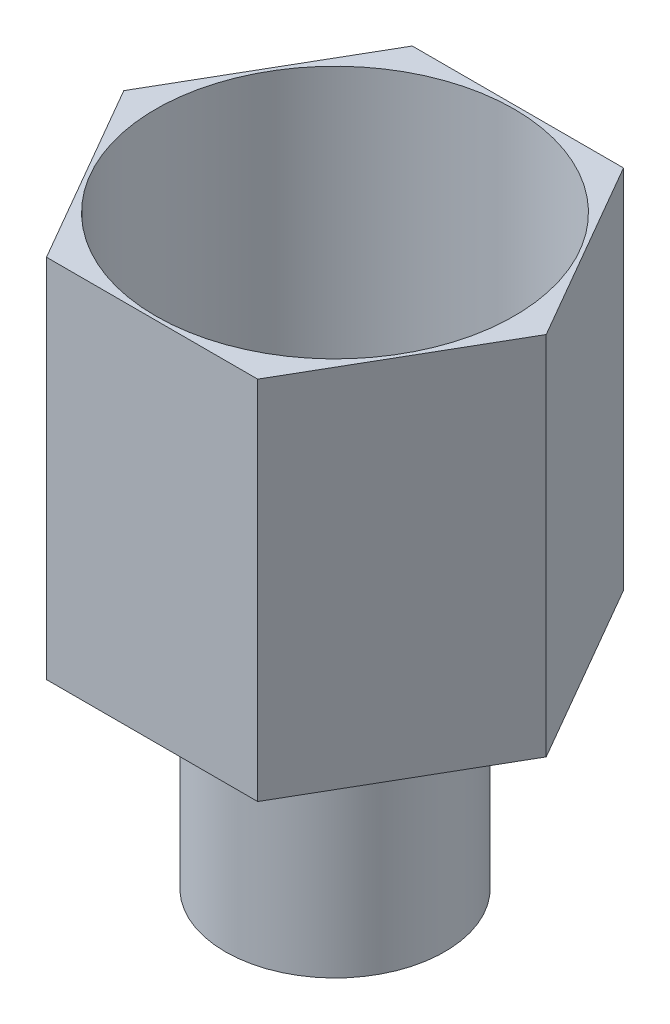
ISO-10303-21;
HEADER;
FILE_DESCRIPTION(('STEP AP214'),'2;1');
FILE_NAME('part.step','',(''),(''),'','','');
FILE_SCHEMA(('AUTOMOTIVE_DESIGN { 1 0 10303 214 1 1 1 1 }'));
ENDSEC;
DATA;
#1=APPLICATION_CONTEXT('core data for automotive mechanical design processes');
#2=APPLICATION_PROTOCOL_DEFINITION('international standard','automotive_design',2000,#1);
#3=PRODUCT_CONTEXT('',#1,'mechanical');
#4=PRODUCT('Part','Part','',(#3));
#5=PRODUCT_RELATED_PRODUCT_CATEGORY('part','',(#4));
#6=PRODUCT_DEFINITION_FORMATION('','',#4);
#7=PRODUCT_DEFINITION_CONTEXT('part definition',#1,'design');
#8=PRODUCT_DEFINITION('design','',#6,#7);
#9=PRODUCT_DEFINITION_SHAPE('','',#8);
#10=(LENGTH_UNIT() NAMED_UNIT(*) SI_UNIT(.MILLI.,.METRE.));
#11=(NAMED_UNIT(*) PLANE_ANGLE_UNIT() SI_UNIT($,.RADIAN.));
#12=(NAMED_UNIT(*) SI_UNIT($,.STERADIAN.) SOLID_ANGLE_UNIT());
#13=UNCERTAINTY_MEASURE_WITH_UNIT(LENGTH_MEASURE(1.E-05),#10,'distance_accuracy_value','');
#14=(GEOMETRIC_REPRESENTATION_CONTEXT(3) GLOBAL_UNCERTAINTY_ASSIGNED_CONTEXT((#13)) GLOBAL_UNIT_ASSIGNED_CONTEXT((#10,
#11,#12)) REPRESENTATION_CONTEXT('',''));
#15=CARTESIAN_POINT('',(0.,0.,0.));
#16=DIRECTION('',(0.,0.,1.));
#17=DIRECTION('',(1.,0.,0.));
#18=AXIS2_PLACEMENT_3D('',#15,#16,#17);
#19=CARTESIAN_POINT('',(-1.44337567297406,5.,2.5));
#20=DIRECTION('',(0.,0.,-1.));
#21=DIRECTION('',(-1.,0.,0.));
#22=AXIS2_PLACEMENT_3D('',#19,#20,#21);
#23=PLANE('',#22);
#24=DIRECTION('',(1.,0.,0.));
#25=VECTOR('',#24,1.);
#26=CARTESIAN_POINT('',(-1.44337567297406,0.,2.5));
#27=LINE('',#26,#25);
#28=CARTESIAN_POINT('',(-1.44337567297406,0.,2.5));
#29=VERTEX_POINT('',#28);
#30=CARTESIAN_POINT('',(1.44337567297406,0.,2.5));
#31=VERTEX_POINT('',#30);
#32=EDGE_CURVE('E120',#29,#31,#27,.T.);
#33=ORIENTED_EDGE('',*,*,#32,.T.);
#34=DIRECTION('',(0.,-1.,0.));
#35=VECTOR('',#34,1.);
#36=CARTESIAN_POINT('',(1.44337567297406,5.,2.5));
#37=LINE('',#36,#35);
#38=CARTESIAN_POINT('',(1.44337567297406,5.,2.5));
#39=VERTEX_POINT('',#38);
#40=EDGE_CURVE('E11',#39,#31,#37,.T.);
#41=ORIENTED_EDGE('',*,*,#40,.F.);
#42=DIRECTION('',(1.,0.,0.));
#43=VECTOR('',#42,1.);
#44=CARTESIAN_POINT('',(-1.44337567297406,5.,2.5));
#45=LINE('',#44,#43);
#46=CARTESIAN_POINT('',(-1.44337567297406,5.,2.5));
#47=VERTEX_POINT('',#46);
#48=EDGE_CURVE('E131',#47,#39,#45,.T.);
#49=ORIENTED_EDGE('',*,*,#48,.F.);
#50=DIRECTION('',(0.,-1.,0.));
#51=VECTOR('',#50,1.);
#52=CARTESIAN_POINT('',(-1.44337567297406,5.,2.5));
#53=LINE('',#52,#51);
#54=EDGE_CURVE('E116',#47,#29,#53,.T.);
#55=ORIENTED_EDGE('',*,*,#54,.T.);
#56=EDGE_LOOP('',(#33,#41,#49,#55));
#57=FACE_BOUND('',#56,.T.);
#58=ADVANCED_FACE('F36',(#57),#23,.F.);
#59=CARTESIAN_POINT('',(1.44337567297406,5.,2.5));
#60=DIRECTION('',(-0.866025403784439,0.,-0.5));
#61=DIRECTION('',(-0.5,0.,0.866025403784439));
#62=AXIS2_PLACEMENT_3D('',#59,#60,#61);
#63=PLANE('',#62);
#64=DIRECTION('',(0.5,0.,-0.866025403784439));
#65=VECTOR('',#64,1.);
#66=CARTESIAN_POINT('',(1.44337567297406,0.,2.5));
#67=LINE('',#66,#65);
#68=CARTESIAN_POINT('',(2.88675134594813,0.,0.));
#69=VERTEX_POINT('',#68);
#70=EDGE_CURVE('E123',#31,#69,#67,.T.);
#71=ORIENTED_EDGE('',*,*,#70,.T.);
#72=DIRECTION('',(0.,-1.,0.));
#73=VECTOR('',#72,1.);
#74=CARTESIAN_POINT('',(2.88675134594813,5.,0.));
#75=LINE('',#74,#73);
#76=CARTESIAN_POINT('',(2.88675134594813,5.,0.));
#77=VERTEX_POINT('',#76);
#78=EDGE_CURVE('E44',#77,#69,#75,.T.);
#79=ORIENTED_EDGE('',*,*,#78,.F.);
#80=DIRECTION('',(0.5,0.,-0.866025403784439));
#81=VECTOR('',#80,1.);
#82=CARTESIAN_POINT('',(1.44337567297406,5.,2.5));
#83=LINE('',#82,#81);
#84=EDGE_CURVE('E89',#39,#77,#83,.T.);
#85=ORIENTED_EDGE('',*,*,#84,.F.);
#86=ORIENTED_EDGE('',*,*,#40,.T.);
#87=EDGE_LOOP('',(#71,#79,#85,#86));
#88=FACE_BOUND('',#87,.T.);
#89=ADVANCED_FACE('F156',(#88),#63,.F.);
#90=CARTESIAN_POINT('',(2.88675134594813,5.,0.));
#91=DIRECTION('',(-0.866025403784438,0.,0.5));
#92=DIRECTION('',(0.5,0.,0.866025403784439));
#93=AXIS2_PLACEMENT_3D('',#90,#91,#92);
#94=PLANE('',#93);
#95=DIRECTION('',(-0.5,0.,-0.866025403784439));
#96=VECTOR('',#95,1.);
#97=CARTESIAN_POINT('',(2.88675134594813,0.,0.));
#98=LINE('',#97,#96);
#99=CARTESIAN_POINT('',(1.44337567297406,0.,-2.5));
#100=VERTEX_POINT('',#99);
#101=EDGE_CURVE('E126',#69,#100,#98,.T.);
#102=ORIENTED_EDGE('',*,*,#101,.T.);
#103=DIRECTION('',(0.,-1.,0.));
#104=VECTOR('',#103,1.);
#105=CARTESIAN_POINT('',(1.44337567297406,5.,-2.5));
#106=LINE('',#105,#104);
#107=CARTESIAN_POINT('',(1.44337567297406,5.,-2.5));
#108=VERTEX_POINT('',#107);
#109=EDGE_CURVE('E111',#108,#100,#106,.T.);
#110=ORIENTED_EDGE('',*,*,#109,.F.);
#111=DIRECTION('',(-0.5,0.,-0.866025403784439));
#112=VECTOR('',#111,1.);
#113=CARTESIAN_POINT('',(2.88675134594813,5.,0.));
#114=LINE('',#113,#112);
#115=EDGE_CURVE('E102',#77,#108,#114,.T.);
#116=ORIENTED_EDGE('',*,*,#115,.F.);
#117=ORIENTED_EDGE('',*,*,#78,.T.);
#118=EDGE_LOOP('',(#102,#110,#116,#117));
#119=FACE_BOUND('',#118,.T.);
#120=ADVANCED_FACE('F137',(#119),#94,.F.);
#121=CARTESIAN_POINT('',(1.44337567297406,5.,-2.5));
#122=DIRECTION('',(0.,0.,1.));
#123=DIRECTION('',(1.,0.,0.));
#124=AXIS2_PLACEMENT_3D('',#121,#122,#123);
#125=PLANE('',#124);
#126=DIRECTION('',(-1.,0.,0.));
#127=VECTOR('',#126,1.);
#128=CARTESIAN_POINT('',(1.44337567297406,0.,-2.5));
#129=LINE('',#128,#127);
#130=CARTESIAN_POINT('',(-1.44337567297406,0.,-2.5));
#131=VERTEX_POINT('',#130);
#132=EDGE_CURVE('E110',#100,#131,#129,.T.);
#133=ORIENTED_EDGE('',*,*,#132,.T.);
#134=DIRECTION('',(0.,-1.,0.));
#135=VECTOR('',#134,1.);
#136=CARTESIAN_POINT('',(-1.44337567297406,5.,-2.5));
#137=LINE('',#136,#135);
#138=CARTESIAN_POINT('',(-1.44337567297406,5.,-2.5));
#139=VERTEX_POINT('',#138);
#140=EDGE_CURVE('E107',#139,#131,#137,.T.);
#141=ORIENTED_EDGE('',*,*,#140,.F.);
#142=DIRECTION('',(-1.,0.,0.));
#143=VECTOR('',#142,1.);
#144=CARTESIAN_POINT('',(1.44337567297406,5.,-2.5));
#145=LINE('',#144,#143);
#146=EDGE_CURVE('E96',#108,#139,#145,.T.);
#147=ORIENTED_EDGE('',*,*,#146,.F.);
#148=ORIENTED_EDGE('',*,*,#109,.T.);
#149=EDGE_LOOP('',(#133,#141,#147,#148));
#150=FACE_BOUND('',#149,.T.);
#151=ADVANCED_FACE('F108',(#150),#125,.F.);
#152=CARTESIAN_POINT('',(-1.44337567297406,5.,-2.5));
#153=DIRECTION('',(0.866025403784439,0.,0.5));
#154=DIRECTION('',(0.5,0.,-0.866025403784439));
#155=AXIS2_PLACEMENT_3D('',#152,#153,#154);
#156=PLANE('',#155);
#157=DIRECTION('',(-0.5,0.,0.866025403784439));
#158=VECTOR('',#157,1.);
#159=CARTESIAN_POINT('',(-1.44337567297406,0.,-2.5));
#160=LINE('',#159,#158);
#161=CARTESIAN_POINT('',(-2.88675134594813,0.,0.));
#162=VERTEX_POINT('',#161);
#163=EDGE_CURVE('E75',#131,#162,#160,.T.);
#164=ORIENTED_EDGE('',*,*,#163,.T.);
#165=DIRECTION('',(0.,-1.,0.));
#166=VECTOR('',#165,1.);
#167=CARTESIAN_POINT('',(-2.88675134594813,5.,0.));
#168=LINE('',#167,#166);
#169=CARTESIAN_POINT('',(-2.88675134594813,5.,0.));
#170=VERTEX_POINT('',#169);
#171=EDGE_CURVE('E112',#170,#162,#168,.T.);
#172=ORIENTED_EDGE('',*,*,#171,.F.);
#173=DIRECTION('',(-0.5,0.,0.866025403784439));
#174=VECTOR('',#173,1.);
#175=CARTESIAN_POINT('',(-1.44337567297406,5.,-2.5));
#176=LINE('',#175,#174);
#177=EDGE_CURVE('E100',#139,#170,#176,.T.);
#178=ORIENTED_EDGE('',*,*,#177,.F.);
#179=ORIENTED_EDGE('',*,*,#140,.T.);
#180=EDGE_LOOP('',(#164,#172,#178,#179));
#181=FACE_BOUND('',#180,.T.);
#182=ADVANCED_FACE('F114',(#181),#156,.F.);
#183=CARTESIAN_POINT('',(-2.88675134594813,5.,0.));
#184=DIRECTION('',(0.866025403784438,0.,-0.5));
#185=DIRECTION('',(-0.5,0.,-0.866025403784439));
#186=AXIS2_PLACEMENT_3D('',#183,#184,#185);
#187=PLANE('',#186);
#188=DIRECTION('',(0.5,0.,0.866025403784439));
#189=VECTOR('',#188,1.);
#190=CARTESIAN_POINT('',(-2.88675134594813,0.,0.));
#191=LINE('',#190,#189);
#192=EDGE_CURVE('E81',#162,#29,#191,.T.);
#193=ORIENTED_EDGE('',*,*,#192,.T.);
#194=ORIENTED_EDGE('',*,*,#54,.F.);
#195=DIRECTION('',(0.5,0.,0.866025403784439));
#196=VECTOR('',#195,1.);
#197=CARTESIAN_POINT('',(-2.88675134594813,5.,0.));
#198=LINE('',#197,#196);
#199=EDGE_CURVE('E52',#170,#47,#198,.T.);
#200=ORIENTED_EDGE('',*,*,#199,.F.);
#201=ORIENTED_EDGE('',*,*,#171,.T.);
#202=EDGE_LOOP('',(#193,#194,#200,#201));
#203=FACE_BOUND('',#202,.T.);
#204=ADVANCED_FACE('F144',(#203),#187,.F.);
#205=CARTESIAN_POINT('',(0.,5.,0.));
#206=DIRECTION('',(0.,1.,0.));
#207=DIRECTION('',(0.,0.,1.));
#208=AXIS2_PLACEMENT_3D('',#205,#206,#207);
#209=PLANE('',#208);
#210=CARTESIAN_POINT('',(0.,5.,0.));
#211=DIRECTION('',(0.,1.,0.));
#212=DIRECTION('',(0.,0.,1.));
#213=AXIS2_PLACEMENT_3D('',#210,#211,#212);
#214=CIRCLE('',#213,2.45);
#215=CARTESIAN_POINT('',(0.,5.,2.45));
#216=VERTEX_POINT('',#215);
#217=EDGE_CURVE('E239',#216,#216,#214,.T.);
#218=ORIENTED_EDGE('',*,*,#217,.F.);
#219=EDGE_LOOP('',(#218));
#220=FACE_BOUND('',#219,.T.);
#221=ORIENTED_EDGE('',*,*,#48,.T.);
#222=ORIENTED_EDGE('',*,*,#84,.T.);
#223=ORIENTED_EDGE('',*,*,#115,.T.);
#224=ORIENTED_EDGE('',*,*,#146,.T.);
#225=ORIENTED_EDGE('',*,*,#177,.T.);
#226=ORIENTED_EDGE('',*,*,#199,.T.);
#227=EDGE_LOOP('',(#221,#222,#223,#224,#225,#226));
#228=FACE_BOUND('',#227,.T.);
#229=ADVANCED_FACE('F98',(#220,#228),#209,.T.);
#230=CARTESIAN_POINT('',(0.,0.,0.));
#231=DIRECTION('',(0.,1.,0.));
#232=DIRECTION('',(0.,0.,1.));
#233=AXIS2_PLACEMENT_3D('',#230,#231,#232);
#234=PLANE('',#233);
#235=CARTESIAN_POINT('',(0.,0.,0.));
#236=DIRECTION('',(0.,1.,0.));
#237=DIRECTION('',(0.,0.,1.));
#238=AXIS2_PLACEMENT_3D('',#235,#236,#237);
#239=CIRCLE('',#238,1.5);
#240=CARTESIAN_POINT('',(0.,0.,1.5));
#241=VERTEX_POINT('',#240);
#242=EDGE_CURVE('E240',#241,#241,#239,.T.);
#243=ORIENTED_EDGE('',*,*,#242,.T.);
#244=EDGE_LOOP('',(#243));
#245=FACE_BOUND('',#244,.T.);
#246=ORIENTED_EDGE('',*,*,#32,.F.);
#247=ORIENTED_EDGE('',*,*,#192,.F.);
#248=ORIENTED_EDGE('',*,*,#163,.F.);
#249=ORIENTED_EDGE('',*,*,#132,.F.);
#250=ORIENTED_EDGE('',*,*,#101,.F.);
#251=ORIENTED_EDGE('',*,*,#70,.F.);
#252=EDGE_LOOP('',(#246,#247,#248,#249,#250,#251));
#253=FACE_BOUND('',#252,.T.);
#254=ADVANCED_FACE('F140',(#245,#253),#234,.F.);
#255=CARTESIAN_POINT('',(0.,1.,0.));
#256=DIRECTION('',(0.,1.,0.));
#257=DIRECTION('',(0.,0.,1.));
#258=AXIS2_PLACEMENT_3D('',#255,#256,#257);
#259=CYLINDRICAL_SURFACE('',#258,2.45);
#260=CARTESIAN_POINT('',(0.,1.,0.));
#261=DIRECTION('',(0.,1.,0.));
#262=DIRECTION('',(0.,0.,1.));
#263=AXIS2_PLACEMENT_3D('',#260,#261,#262);
#264=CIRCLE('',#263,2.45);
#265=CARTESIAN_POINT('',(0.,1.,2.45));
#266=VERTEX_POINT('',#265);
#267=EDGE_CURVE('E124',#266,#266,#264,.T.);
#268=ORIENTED_EDGE('',*,*,#267,.F.);
#269=EDGE_LOOP('',(#268));
#270=FACE_BOUND('',#269,.T.);
#271=ORIENTED_EDGE('',*,*,#217,.T.);
#272=EDGE_LOOP('',(#271));
#273=FACE_BOUND('',#272,.T.);
#274=ADVANCED_FACE('F191',(#270,#273),#259,.F.);
#275=CARTESIAN_POINT('',(0.,1.,0.));
#276=DIRECTION('',(0.,1.,0.));
#277=DIRECTION('',(0.,0.,1.));
#278=AXIS2_PLACEMENT_3D('',#275,#276,#277);
#279=PLANE('',#278);
#280=ORIENTED_EDGE('',*,*,#267,.T.);
#281=EDGE_LOOP('',(#280));
#282=FACE_BOUND('',#281,.T.);
#283=ADVANCED_FACE('F196',(#282),#279,.T.);
#284=CARTESIAN_POINT('',(0.,-3.,0.));
#285=DIRECTION('',(0.,1.,0.));
#286=DIRECTION('',(0.,0.,1.));
#287=AXIS2_PLACEMENT_3D('',#284,#285,#286);
#288=CYLINDRICAL_SURFACE('',#287,1.5);
#289=CARTESIAN_POINT('',(0.,-3.,0.));
#290=DIRECTION('',(0.,1.,0.));
#291=DIRECTION('',(0.,0.,1.));
#292=AXIS2_PLACEMENT_3D('',#289,#290,#291);
#293=CIRCLE('',#292,1.5);
#294=CARTESIAN_POINT('',(0.,-3.,1.5));
#295=VERTEX_POINT('',#294);
#296=EDGE_CURVE('E238',#295,#295,#293,.T.);
#297=ORIENTED_EDGE('',*,*,#296,.T.);
#298=EDGE_LOOP('',(#297));
#299=FACE_BOUND('',#298,.T.);
#300=ORIENTED_EDGE('',*,*,#242,.F.);
#301=EDGE_LOOP('',(#300));
#302=FACE_BOUND('',#301,.T.);
#303=ADVANCED_FACE('F206',(#299,#302),#288,.T.);
#304=CARTESIAN_POINT('',(0.,-3.,0.));
#305=DIRECTION('',(0.,1.,0.));
#306=DIRECTION('',(0.,0.,1.));
#307=AXIS2_PLACEMENT_3D('',#304,#305,#306);
#308=PLANE('',#307);
#309=ORIENTED_EDGE('',*,*,#296,.F.);
#310=EDGE_LOOP('',(#309));
#311=FACE_BOUND('',#310,.T.);
#312=ADVANCED_FACE('F222',(#311),#308,.F.);
#313=CLOSED_SHELL('',(#58,#89,#120,#151,#182,#204,#229,#254,#274,#283,#303,#312));
#314=MANIFOLD_SOLID_BREP('B2',#313);
#315=ADVANCED_BREP_SHAPE_REPRESENTATION('',(#18,#314),#14);
#316=SHAPE_DEFINITION_REPRESENTATION(#9,#315);
ENDSEC;
END-ISO-10303-21;
